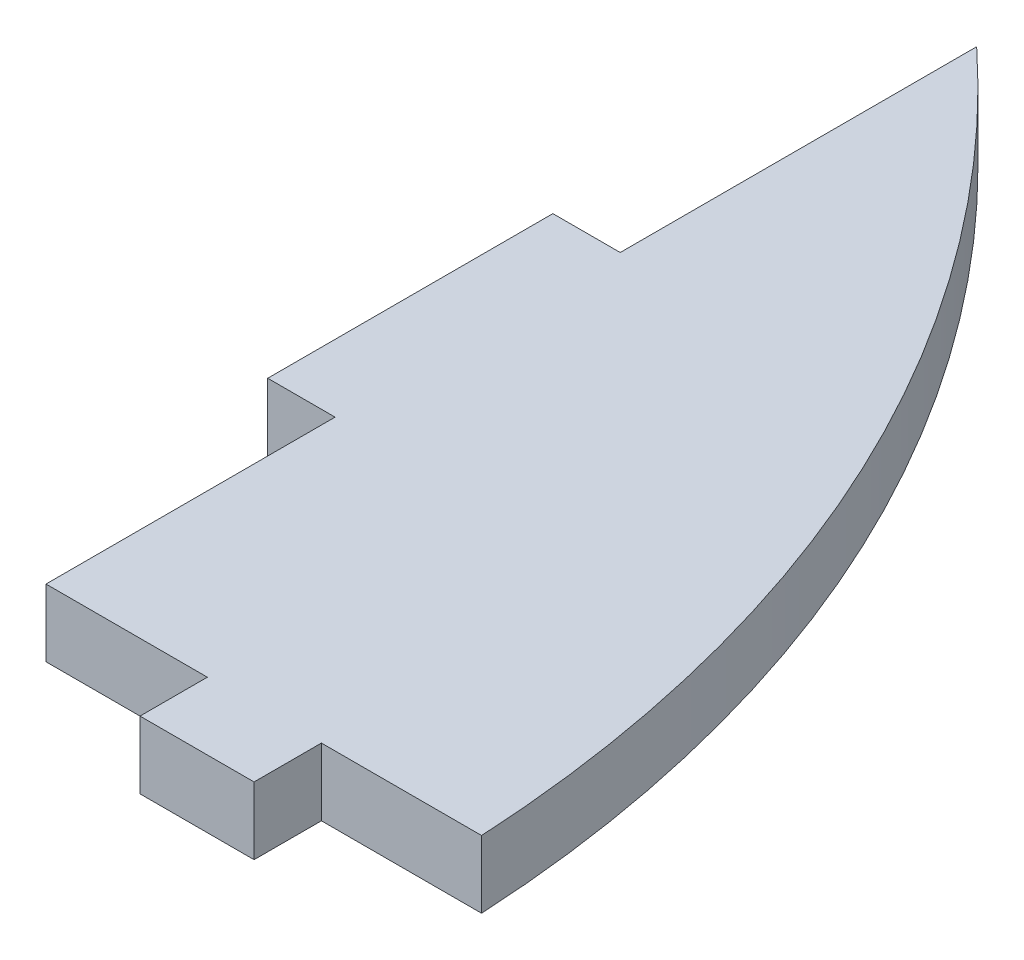
ISO-10303-21;
HEADER;
FILE_DESCRIPTION(('STEP AP214'),'2;1');
FILE_NAME('part.step','',(''),(''),'','','');
FILE_SCHEMA(('AUTOMOTIVE_DESIGN { 1 0 10303 214 1 1 1 1 }'));
ENDSEC;
DATA;
#1=APPLICATION_CONTEXT('core data for automotive mechanical design processes');
#2=APPLICATION_PROTOCOL_DEFINITION('international standard','automotive_design',2000,#1);
#3=PRODUCT_CONTEXT('',#1,'mechanical');
#4=PRODUCT('Part','Part','',(#3));
#5=PRODUCT_RELATED_PRODUCT_CATEGORY('part','',(#4));
#6=PRODUCT_DEFINITION_FORMATION('','',#4);
#7=PRODUCT_DEFINITION_CONTEXT('part definition',#1,'design');
#8=PRODUCT_DEFINITION('design','',#6,#7);
#9=PRODUCT_DEFINITION_SHAPE('','',#8);
#10=(LENGTH_UNIT() NAMED_UNIT(*) SI_UNIT(.MILLI.,.METRE.));
#11=(NAMED_UNIT(*) PLANE_ANGLE_UNIT() SI_UNIT($,.RADIAN.));
#12=(NAMED_UNIT(*) SI_UNIT($,.STERADIAN.) SOLID_ANGLE_UNIT());
#13=UNCERTAINTY_MEASURE_WITH_UNIT(LENGTH_MEASURE(1.E-05),#10,'distance_accuracy_value','');
#14=(GEOMETRIC_REPRESENTATION_CONTEXT(3) GLOBAL_UNCERTAINTY_ASSIGNED_CONTEXT((#13)) GLOBAL_UNIT_ASSIGNED_CONTEXT((#10,
#11,#12)) REPRESENTATION_CONTEXT('',''));
#15=CARTESIAN_POINT('',(0.,0.,0.));
#16=DIRECTION('',(0.,0.,1.));
#17=DIRECTION('',(1.,0.,0.));
#18=AXIS2_PLACEMENT_3D('',#15,#16,#17);
#19=CARTESIAN_POINT('',(0.,3.,0.));
#20=DIRECTION('',(0.,0.,-1.));
#21=DIRECTION('',(-1.,0.,0.));
#22=AXIS2_PLACEMENT_3D('',#19,#20,#21);
#23=PLANE('',#22);
#24=DIRECTION('',(1.,0.,0.));
#25=VECTOR('',#24,1.);
#26=CARTESIAN_POINT('',(0.,0.,0.));
#27=LINE('',#26,#25);
#28=CARTESIAN_POINT('',(0.,0.,0.));
#29=VERTEX_POINT('',#28);
#30=CARTESIAN_POINT('',(7.18674570107116,0.,0.));
#31=VERTEX_POINT('',#30);
#32=EDGE_CURVE('E147',#29,#31,#27,.T.);
#33=ORIENTED_EDGE('',*,*,#32,.T.);
#34=DIRECTION('',(0.,-1.,0.));
#35=VECTOR('',#34,1.);
#36=CARTESIAN_POINT('',(7.18674570107116,3.,0.));
#37=LINE('',#36,#35);
#38=CARTESIAN_POINT('',(7.18674570107116,3.,0.));
#39=VERTEX_POINT('',#38);
#40=EDGE_CURVE('E11',#39,#31,#37,.T.);
#41=ORIENTED_EDGE('',*,*,#40,.F.);
#42=DIRECTION('',(1.,0.,0.));
#43=VECTOR('',#42,1.);
#44=CARTESIAN_POINT('',(0.,3.,0.));
#45=LINE('',#44,#43);
#46=CARTESIAN_POINT('',(0.,3.,0.));
#47=VERTEX_POINT('',#46);
#48=EDGE_CURVE('E167',#47,#39,#45,.T.);
#49=ORIENTED_EDGE('',*,*,#48,.F.);
#50=DIRECTION('',(0.,-1.,0.));
#51=VECTOR('',#50,1.);
#52=CARTESIAN_POINT('',(0.,3.,0.));
#53=LINE('',#52,#51);
#54=EDGE_CURVE('E143',#47,#29,#53,.T.);
#55=ORIENTED_EDGE('',*,*,#54,.T.);
#56=EDGE_LOOP('',(#33,#41,#49,#55));
#57=FACE_BOUND('',#56,.T.);
#58=ADVANCED_FACE('F33',(#57),#23,.F.);
#59=CARTESIAN_POINT('',(7.18674570107116,3.,0.));
#60=DIRECTION('',(1.,0.,0.));
#61=DIRECTION('',(0.,0.,-1.));
#62=AXIS2_PLACEMENT_3D('',#59,#60,#61);
#63=PLANE('',#62);
#64=DIRECTION('',(0.,0.,1.));
#65=VECTOR('',#64,1.);
#66=CARTESIAN_POINT('',(7.18674570107116,0.,0.));
#67=LINE('',#66,#65);
#68=CARTESIAN_POINT('',(7.18674570107116,0.,3.));
#69=VERTEX_POINT('',#68);
#70=EDGE_CURVE('E150',#31,#69,#67,.T.);
#71=ORIENTED_EDGE('',*,*,#70,.T.);
#72=DIRECTION('',(0.,-1.,0.));
#73=VECTOR('',#72,1.);
#74=CARTESIAN_POINT('',(7.18674570107116,3.,3.));
#75=LINE('',#74,#73);
#76=CARTESIAN_POINT('',(7.18674570107116,3.,3.));
#77=VERTEX_POINT('',#76);
#78=EDGE_CURVE('E41',#77,#69,#75,.T.);
#79=ORIENTED_EDGE('',*,*,#78,.F.);
#80=DIRECTION('',(0.,0.,1.));
#81=VECTOR('',#80,1.);
#82=CARTESIAN_POINT('',(7.18674570107116,3.,0.));
#83=LINE('',#82,#81);
#84=EDGE_CURVE('E101',#39,#77,#83,.T.);
#85=ORIENTED_EDGE('',*,*,#84,.F.);
#86=ORIENTED_EDGE('',*,*,#40,.T.);
#87=EDGE_LOOP('',(#71,#79,#85,#86));
#88=FACE_BOUND('',#87,.T.);
#89=ADVANCED_FACE('F239',(#88),#63,.F.);
#90=CARTESIAN_POINT('',(7.18674570107116,3.,3.));
#91=DIRECTION('',(0.,0.,-1.));
#92=DIRECTION('',(-1.,0.,0.));
#93=AXIS2_PLACEMENT_3D('',#90,#91,#92);
#94=PLANE('',#93);
#95=DIRECTION('',(1.,0.,0.));
#96=VECTOR('',#95,1.);
#97=CARTESIAN_POINT('',(7.18674570107116,0.,3.));
#98=LINE('',#97,#96);
#99=CARTESIAN_POINT('',(12.2667457010712,0.,3.));
#100=VERTEX_POINT('',#99);
#101=EDGE_CURVE('E152',#69,#100,#98,.T.);
#102=ORIENTED_EDGE('',*,*,#101,.T.);
#103=DIRECTION('',(0.,-1.,0.));
#104=VECTOR('',#103,1.);
#105=CARTESIAN_POINT('',(12.2667457010712,3.,3.));
#106=LINE('',#105,#104);
#107=CARTESIAN_POINT('',(12.2667457010712,3.,3.));
#108=VERTEX_POINT('',#107);
#109=EDGE_CURVE('E183',#108,#100,#106,.T.);
#110=ORIENTED_EDGE('',*,*,#109,.F.);
#111=DIRECTION('',(1.,0.,0.));
#112=VECTOR('',#111,1.);
#113=CARTESIAN_POINT('',(7.18674570107116,3.,3.));
#114=LINE('',#113,#112);
#115=EDGE_CURVE('E191',#77,#108,#114,.T.);
#116=ORIENTED_EDGE('',*,*,#115,.F.);
#117=ORIENTED_EDGE('',*,*,#78,.T.);
#118=EDGE_LOOP('',(#102,#110,#116,#117));
#119=FACE_BOUND('',#118,.T.);
#120=ADVANCED_FACE('F189',(#119),#94,.F.);
#121=CARTESIAN_POINT('',(12.2667457010712,3.,0.));
#122=DIRECTION('',(-1.,0.,0.));
#123=DIRECTION('',(0.,0.,1.));
#124=AXIS2_PLACEMENT_3D('',#121,#122,#123);
#125=PLANE('',#124);
#126=DIRECTION('',(0.,0.,-1.));
#127=VECTOR('',#126,1.);
#128=CARTESIAN_POINT('',(12.2667457010712,0.,0.));
#129=LINE('',#128,#127);
#130=CARTESIAN_POINT('',(12.2667457010712,0.,0.));
#131=VERTEX_POINT('',#130);
#132=EDGE_CURVE('E154',#100,#131,#129,.T.);
#133=ORIENTED_EDGE('',*,*,#132,.T.);
#134=DIRECTION('',(0.,-1.,0.));
#135=VECTOR('',#134,1.);
#136=CARTESIAN_POINT('',(12.2667457010712,3.,0.));
#137=LINE('',#136,#135);
#138=CARTESIAN_POINT('',(12.2667457010712,3.,0.));
#139=VERTEX_POINT('',#138);
#140=EDGE_CURVE('E180',#139,#131,#137,.T.);
#141=ORIENTED_EDGE('',*,*,#140,.F.);
#142=DIRECTION('',(0.,0.,-1.));
#143=VECTOR('',#142,1.);
#144=CARTESIAN_POINT('',(12.2667457010712,3.,0.));
#145=LINE('',#144,#143);
#146=EDGE_CURVE('E209',#108,#139,#145,.T.);
#147=ORIENTED_EDGE('',*,*,#146,.F.);
#148=ORIENTED_EDGE('',*,*,#109,.T.);
#149=EDGE_LOOP('',(#133,#141,#147,#148));
#150=FACE_BOUND('',#149,.T.);
#151=ADVANCED_FACE('F200',(#150),#125,.F.);
#152=CARTESIAN_POINT('',(12.2667457010712,3.,0.));
#153=DIRECTION('',(0.,0.,-1.));
#154=DIRECTION('',(-1.,0.,0.));
#155=AXIS2_PLACEMENT_3D('',#152,#153,#154);
#156=PLANE('',#155);
#157=DIRECTION('',(1.,0.,0.));
#158=VECTOR('',#157,1.);
#159=CARTESIAN_POINT('',(12.2667457010712,0.,0.));
#160=LINE('',#159,#158);
#161=CARTESIAN_POINT('',(19.4,0.,0.));
#162=VERTEX_POINT('',#161);
#163=EDGE_CURVE('E156',#131,#162,#160,.T.);
#164=ORIENTED_EDGE('',*,*,#163,.T.);
#165=DIRECTION('',(0.,-1.,0.));
#166=VECTOR('',#165,1.);
#167=CARTESIAN_POINT('',(19.4,3.,0.));
#168=LINE('',#167,#166);
#169=CARTESIAN_POINT('',(19.4,3.,0.));
#170=VERTEX_POINT('',#169);
#171=EDGE_CURVE('E177',#170,#162,#168,.T.);
#172=ORIENTED_EDGE('',*,*,#171,.F.);
#173=DIRECTION('',(1.,0.,0.));
#174=VECTOR('',#173,1.);
#175=CARTESIAN_POINT('',(12.2667457010712,3.,0.));
#176=LINE('',#175,#174);
#177=EDGE_CURVE('E206',#139,#170,#176,.T.);
#178=ORIENTED_EDGE('',*,*,#177,.F.);
#179=ORIENTED_EDGE('',*,*,#140,.T.);
#180=EDGE_LOOP('',(#164,#172,#178,#179));
#181=FACE_BOUND('',#180,.T.);
#182=ADVANCED_FACE('F204',(#181),#156,.F.);
#183=CARTESIAN_POINT('',(-41.4745579357403,3.,3.22642156702926));
#184=DIRECTION('',(0.,-1.,0.));
#185=DIRECTION('',(0.,0.,-1.));
#186=AXIS2_PLACEMENT_3D('',#183,#184,#185);
#187=CYLINDRICAL_SURFACE('',#186,60.96);
#188=CARTESIAN_POINT('',(-41.4745579357403,0.,3.22642156702926));
#189=DIRECTION('',(0.,1.,0.));
#190=DIRECTION('',(0.,0.,-1.));
#191=AXIS2_PLACEMENT_3D('',#188,#189,#190);
#192=CIRCLE('',#191,60.96);
#193=CARTESIAN_POINT('',(0.,0.,-41.45));
#194=VERTEX_POINT('',#193);
#195=EDGE_CURVE('E158',#162,#194,#192,.T.);
#196=ORIENTED_EDGE('',*,*,#195,.T.);
#197=DIRECTION('',(0.,-1.,0.));
#198=VECTOR('',#197,1.);
#199=CARTESIAN_POINT('',(0.,3.,-41.45));
#200=LINE('',#199,#198);
#201=CARTESIAN_POINT('',(0.,3.,-41.45));
#202=VERTEX_POINT('',#201);
#203=EDGE_CURVE('E174',#202,#194,#200,.T.);
#204=ORIENTED_EDGE('',*,*,#203,.F.);
#205=CARTESIAN_POINT('',(-41.4745579357403,3.,3.22642156702926));
#206=DIRECTION('',(0.,1.,0.));
#207=DIRECTION('',(0.,0.,-1.));
#208=AXIS2_PLACEMENT_3D('',#205,#206,#207);
#209=CIRCLE('',#208,60.96);
#210=EDGE_CURVE('E208',#170,#202,#209,.T.);
#211=ORIENTED_EDGE('',*,*,#210,.F.);
#212=ORIENTED_EDGE('',*,*,#171,.T.);
#213=EDGE_LOOP('',(#196,#204,#211,#212));
#214=FACE_BOUND('',#213,.T.);
#215=ADVANCED_FACE('F252',(#214),#187,.T.);
#216=CARTESIAN_POINT('',(0.,3.,-25.575));
#217=DIRECTION('',(1.,0.,0.));
#218=DIRECTION('',(0.,0.,-1.));
#219=AXIS2_PLACEMENT_3D('',#216,#217,#218);
#220=PLANE('',#219);
#221=DIRECTION('',(0.,0.,1.));
#222=VECTOR('',#221,1.);
#223=CARTESIAN_POINT('',(0.,0.,-25.575));
#224=LINE('',#223,#222);
#225=CARTESIAN_POINT('',(0.,0.,-25.575));
#226=VERTEX_POINT('',#225);
#227=EDGE_CURVE('E160',#194,#226,#224,.T.);
#228=ORIENTED_EDGE('',*,*,#227,.T.);
#229=DIRECTION('',(0.,-1.,0.));
#230=VECTOR('',#229,1.);
#231=CARTESIAN_POINT('',(0.,3.,-25.575));
#232=LINE('',#231,#230);
#233=CARTESIAN_POINT('',(0.,3.,-25.575));
#234=VERTEX_POINT('',#233);
#235=EDGE_CURVE('E171',#234,#226,#232,.T.);
#236=ORIENTED_EDGE('',*,*,#235,.F.);
#237=DIRECTION('',(0.,0.,1.));
#238=VECTOR('',#237,1.);
#239=CARTESIAN_POINT('',(0.,3.,-25.575));
#240=LINE('',#239,#238);
#241=EDGE_CURVE('E211',#202,#234,#240,.T.);
#242=ORIENTED_EDGE('',*,*,#241,.F.);
#243=ORIENTED_EDGE('',*,*,#203,.T.);
#244=EDGE_LOOP('',(#228,#236,#242,#243));
#245=FACE_BOUND('',#244,.T.);
#246=ADVANCED_FACE('F220',(#245),#220,.F.);
#247=CARTESIAN_POINT('',(0.,3.,-25.575));
#248=DIRECTION('',(0.,0.,1.));
#249=DIRECTION('',(1.,0.,0.));
#250=AXIS2_PLACEMENT_3D('',#247,#248,#249);
#251=PLANE('',#250);
#252=DIRECTION('',(-1.,0.,0.));
#253=VECTOR('',#252,1.);
#254=CARTESIAN_POINT('',(0.,0.,-25.575));
#255=LINE('',#254,#253);
#256=CARTESIAN_POINT('',(-3.,0.,-25.575));
#257=VERTEX_POINT('',#256);
#258=EDGE_CURVE('E162',#226,#257,#255,.T.);
#259=ORIENTED_EDGE('',*,*,#258,.T.);
#260=DIRECTION('',(0.,-1.,0.));
#261=VECTOR('',#260,1.);
#262=CARTESIAN_POINT('',(-3.,3.,-25.575));
#263=LINE('',#262,#261);
#264=CARTESIAN_POINT('',(-3.,3.,-25.575));
#265=VERTEX_POINT('',#264);
#266=EDGE_CURVE('E138',#265,#257,#263,.T.);
#267=ORIENTED_EDGE('',*,*,#266,.F.);
#268=DIRECTION('',(-1.,0.,0.));
#269=VECTOR('',#268,1.);
#270=CARTESIAN_POINT('',(0.,3.,-25.575));
#271=LINE('',#270,#269);
#272=EDGE_CURVE('E129',#234,#265,#271,.T.);
#273=ORIENTED_EDGE('',*,*,#272,.F.);
#274=ORIENTED_EDGE('',*,*,#235,.T.);
#275=EDGE_LOOP('',(#259,#267,#273,#274));
#276=FACE_BOUND('',#275,.T.);
#277=ADVANCED_FACE('F224',(#276),#251,.F.);
#278=CARTESIAN_POINT('',(-3.,3.,-12.875));
#279=DIRECTION('',(1.,0.,0.));
#280=DIRECTION('',(0.,0.,-1.));
#281=AXIS2_PLACEMENT_3D('',#278,#279,#280);
#282=PLANE('',#281);
#283=DIRECTION('',(0.,0.,1.));
#284=VECTOR('',#283,1.);
#285=CARTESIAN_POINT('',(-3.,0.,-12.875));
#286=LINE('',#285,#284);
#287=CARTESIAN_POINT('',(-3.,0.,-12.875));
#288=VERTEX_POINT('',#287);
#289=EDGE_CURVE('E137',#257,#288,#286,.T.);
#290=ORIENTED_EDGE('',*,*,#289,.T.);
#291=DIRECTION('',(0.,-1.,0.));
#292=VECTOR('',#291,1.);
#293=CARTESIAN_POINT('',(-3.,3.,-12.875));
#294=LINE('',#293,#292);
#295=CARTESIAN_POINT('',(-3.,3.,-12.875));
#296=VERTEX_POINT('',#295);
#297=EDGE_CURVE('E134',#296,#288,#294,.T.);
#298=ORIENTED_EDGE('',*,*,#297,.F.);
#299=DIRECTION('',(0.,0.,1.));
#300=VECTOR('',#299,1.);
#301=CARTESIAN_POINT('',(-3.,3.,-12.875));
#302=LINE('',#301,#300);
#303=EDGE_CURVE('E123',#265,#296,#302,.T.);
#304=ORIENTED_EDGE('',*,*,#303,.F.);
#305=ORIENTED_EDGE('',*,*,#266,.T.);
#306=EDGE_LOOP('',(#290,#298,#304,#305));
#307=FACE_BOUND('',#306,.T.);
#308=ADVANCED_FACE('F135',(#307),#282,.F.);
#309=CARTESIAN_POINT('',(0.,3.,-12.875));
#310=DIRECTION('',(0.,0.,-1.));
#311=DIRECTION('',(-1.,0.,0.));
#312=AXIS2_PLACEMENT_3D('',#309,#310,#311);
#313=PLANE('',#312);
#314=DIRECTION('',(1.,0.,0.));
#315=VECTOR('',#314,1.);
#316=CARTESIAN_POINT('',(0.,0.,-12.875));
#317=LINE('',#316,#315);
#318=CARTESIAN_POINT('',(0.,0.,-12.875));
#319=VERTEX_POINT('',#318);
#320=EDGE_CURVE('E87',#288,#319,#317,.T.);
#321=ORIENTED_EDGE('',*,*,#320,.T.);
#322=DIRECTION('',(0.,-1.,0.));
#323=VECTOR('',#322,1.);
#324=CARTESIAN_POINT('',(0.,3.,-12.875));
#325=LINE('',#324,#323);
#326=CARTESIAN_POINT('',(0.,3.,-12.875));
#327=VERTEX_POINT('',#326);
#328=EDGE_CURVE('E139',#327,#319,#325,.T.);
#329=ORIENTED_EDGE('',*,*,#328,.F.);
#330=DIRECTION('',(1.,0.,0.));
#331=VECTOR('',#330,1.);
#332=CARTESIAN_POINT('',(0.,3.,-12.875));
#333=LINE('',#332,#331);
#334=EDGE_CURVE('E127',#296,#327,#333,.T.);
#335=ORIENTED_EDGE('',*,*,#334,.F.);
#336=ORIENTED_EDGE('',*,*,#297,.T.);
#337=EDGE_LOOP('',(#321,#329,#335,#336));
#338=FACE_BOUND('',#337,.T.);
#339=ADVANCED_FACE('F141',(#338),#313,.F.);
#340=CARTESIAN_POINT('',(0.,3.,0.));
#341=DIRECTION('',(1.,0.,0.));
#342=DIRECTION('',(0.,0.,-1.));
#343=AXIS2_PLACEMENT_3D('',#340,#341,#342);
#344=PLANE('',#343);
#345=DIRECTION('',(0.,0.,1.));
#346=VECTOR('',#345,1.);
#347=CARTESIAN_POINT('',(0.,0.,0.));
#348=LINE('',#347,#346);
#349=EDGE_CURVE('E93',#319,#29,#348,.T.);
#350=ORIENTED_EDGE('',*,*,#349,.T.);
#351=ORIENTED_EDGE('',*,*,#54,.F.);
#352=DIRECTION('',(0.,0.,1.));
#353=VECTOR('',#352,1.);
#354=CARTESIAN_POINT('',(0.,3.,0.));
#355=LINE('',#354,#353);
#356=EDGE_CURVE('E49',#327,#47,#355,.T.);
#357=ORIENTED_EDGE('',*,*,#356,.F.);
#358=ORIENTED_EDGE('',*,*,#328,.T.);
#359=EDGE_LOOP('',(#350,#351,#357,#358));
#360=FACE_BOUND('',#359,.T.);
#361=ADVANCED_FACE('F228',(#360),#344,.F.);
#362=CARTESIAN_POINT('',(-41.4745579357403,3.,3.22642156702926));
#363=DIRECTION('',(0.,-1.,0.));
#364=DIRECTION('',(0.,0.,-1.));
#365=AXIS2_PLACEMENT_3D('',#362,#363,#364);
#366=PLANE('',#365);
#367=ORIENTED_EDGE('',*,*,#48,.T.);
#368=ORIENTED_EDGE('',*,*,#84,.T.);
#369=ORIENTED_EDGE('',*,*,#115,.T.);
#370=ORIENTED_EDGE('',*,*,#146,.T.);
#371=ORIENTED_EDGE('',*,*,#177,.T.);
#372=ORIENTED_EDGE('',*,*,#210,.T.);
#373=ORIENTED_EDGE('',*,*,#241,.T.);
#374=ORIENTED_EDGE('',*,*,#272,.T.);
#375=ORIENTED_EDGE('',*,*,#303,.T.);
#376=ORIENTED_EDGE('',*,*,#334,.T.);
#377=ORIENTED_EDGE('',*,*,#356,.T.);
#378=EDGE_LOOP('',(#367,#368,#369,#370,#371,#372,#373,#374,#375,#376,#377));
#379=FACE_BOUND('',#378,.T.);
#380=ADVANCED_FACE('F125',(#379),#366,.F.);
#381=CARTESIAN_POINT('',(-41.4745579357403,0.,3.22642156702926));
#382=DIRECTION('',(0.,-1.,0.));
#383=DIRECTION('',(0.,0.,-1.));
#384=AXIS2_PLACEMENT_3D('',#381,#382,#383);
#385=PLANE('',#384);
#386=ORIENTED_EDGE('',*,*,#32,.F.);
#387=ORIENTED_EDGE('',*,*,#349,.F.);
#388=ORIENTED_EDGE('',*,*,#320,.F.);
#389=ORIENTED_EDGE('',*,*,#289,.F.);
#390=ORIENTED_EDGE('',*,*,#258,.F.);
#391=ORIENTED_EDGE('',*,*,#227,.F.);
#392=ORIENTED_EDGE('',*,*,#195,.F.);
#393=ORIENTED_EDGE('',*,*,#163,.F.);
#394=ORIENTED_EDGE('',*,*,#132,.F.);
#395=ORIENTED_EDGE('',*,*,#101,.F.);
#396=ORIENTED_EDGE('',*,*,#70,.F.);
#397=EDGE_LOOP('',(#386,#387,#388,#389,#390,#391,#392,#393,#394,#395,#396));
#398=FACE_BOUND('',#397,.T.);
#399=ADVANCED_FACE('F195',(#398),#385,.T.);
#400=CLOSED_SHELL('',(#58,#89,#120,#151,#182,#215,#246,#277,#308,#339,#361,#380,#399));
#401=MANIFOLD_SOLID_BREP('B2',#400);
#402=ADVANCED_BREP_SHAPE_REPRESENTATION('',(#18,#401),#14);
#403=SHAPE_DEFINITION_REPRESENTATION(#9,#402);
ENDSEC;
END-ISO-10303-21;
